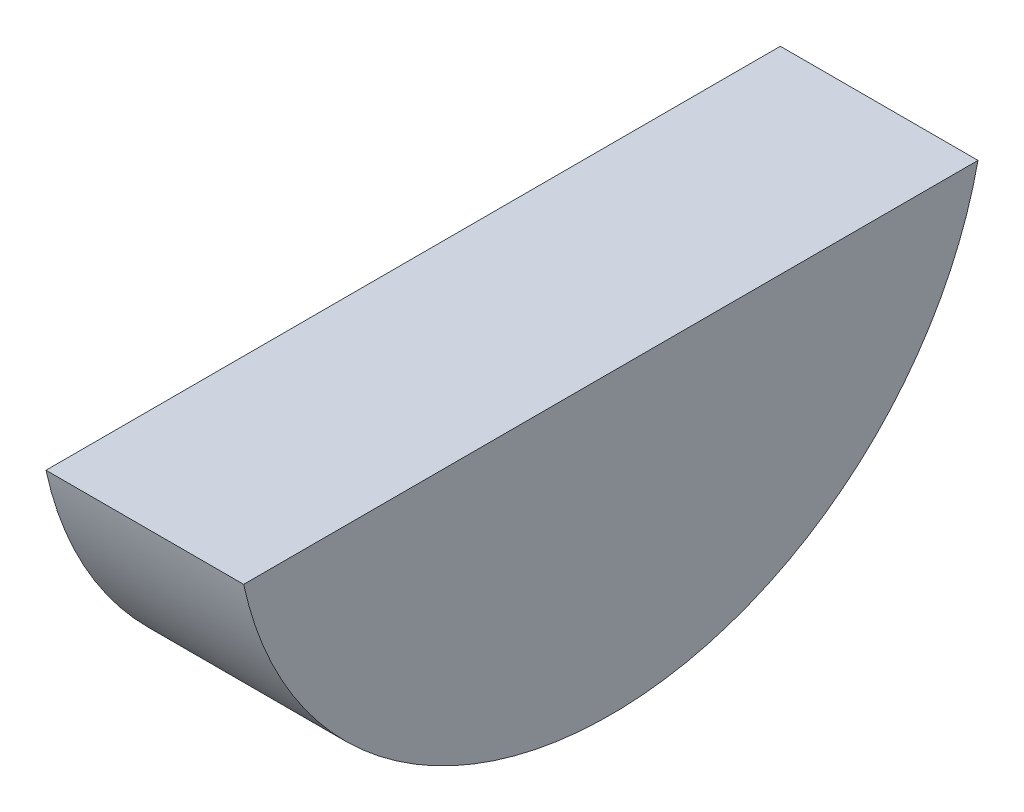
ISO-10303-21;
HEADER;
FILE_DESCRIPTION(('STEP AP214'),'2;1');
FILE_NAME('part.step','',(''),(''),'','','');
FILE_SCHEMA(('AUTOMOTIVE_DESIGN { 1 0 10303 214 1 1 1 1 }'));
ENDSEC;
DATA;
#1=APPLICATION_CONTEXT('core data for automotive mechanical design processes');
#2=APPLICATION_PROTOCOL_DEFINITION('international standard','automotive_design',2000,#1);
#3=PRODUCT_CONTEXT('',#1,'mechanical');
#4=PRODUCT('Part','Part','',(#3));
#5=PRODUCT_RELATED_PRODUCT_CATEGORY('part','',(#4));
#6=PRODUCT_DEFINITION_FORMATION('','',#4);
#7=PRODUCT_DEFINITION_CONTEXT('part definition',#1,'design');
#8=PRODUCT_DEFINITION('design','',#6,#7);
#9=PRODUCT_DEFINITION_SHAPE('','',#8);
#10=(LENGTH_UNIT() NAMED_UNIT(*) SI_UNIT(.MILLI.,.METRE.));
#11=(NAMED_UNIT(*) PLANE_ANGLE_UNIT() SI_UNIT($,.RADIAN.));
#12=(NAMED_UNIT(*) SI_UNIT($,.STERADIAN.) SOLID_ANGLE_UNIT());
#13=UNCERTAINTY_MEASURE_WITH_UNIT(LENGTH_MEASURE(1.E-05),#10,'distance_accuracy_value','');
#14=(GEOMETRIC_REPRESENTATION_CONTEXT(3) GLOBAL_UNCERTAINTY_ASSIGNED_CONTEXT((#13)) GLOBAL_UNIT_ASSIGNED_CONTEXT((#10,
#11,#12)) REPRESENTATION_CONTEXT('',''));
#15=CARTESIAN_POINT('',(0.,0.,0.));
#16=DIRECTION('',(0.,0.,1.));
#17=DIRECTION('',(1.,0.,0.));
#18=AXIS2_PLACEMENT_3D('',#15,#16,#17);
#19=CARTESIAN_POINT('',(5.,9.5,0.));
#20=DIRECTION('',(-1.,0.,0.));
#21=DIRECTION('',(0.,0.,1.));
#22=AXIS2_PLACEMENT_3D('',#19,#20,#21);
#23=CYLINDRICAL_SURFACE('',#22,9.5);
#24=CARTESIAN_POINT('',(0.,9.5,0.));
#25=DIRECTION('',(1.,0.,0.));
#26=DIRECTION('',(0.,0.,-1.));
#27=AXIS2_PLACEMENT_3D('',#24,#25,#26);
#28=CIRCLE('',#27,9.5);
#29=CARTESIAN_POINT('',(0.,7.5,9.28708781050335));
#30=VERTEX_POINT('',#29);
#31=CARTESIAN_POINT('',(0.,7.5,-9.28708781050335));
#32=VERTEX_POINT('',#31);
#33=EDGE_CURVE('E76',#30,#32,#28,.T.);
#34=ORIENTED_EDGE('',*,*,#33,.T.);
#35=DIRECTION('',(-1.,0.,0.));
#36=VECTOR('',#35,1.);
#37=CARTESIAN_POINT('',(5.,7.5,-9.28708781050335));
#38=LINE('',#37,#36);
#39=CARTESIAN_POINT('',(5.,7.5,-9.28708781050335));
#40=VERTEX_POINT('',#39);
#41=EDGE_CURVE('E11',#40,#32,#38,.T.);
#42=ORIENTED_EDGE('',*,*,#41,.F.);
#43=CARTESIAN_POINT('',(5.,9.5,0.));
#44=DIRECTION('',(1.,0.,0.));
#45=DIRECTION('',(0.,0.,-1.));
#46=AXIS2_PLACEMENT_3D('',#43,#44,#45);
#47=CIRCLE('',#46,9.5);
#48=CARTESIAN_POINT('',(5.,7.5,9.28708781050335));
#49=VERTEX_POINT('',#48);
#50=EDGE_CURVE('E75',#49,#40,#47,.T.);
#51=ORIENTED_EDGE('',*,*,#50,.F.);
#52=DIRECTION('',(-1.,0.,0.));
#53=VECTOR('',#52,1.);
#54=CARTESIAN_POINT('',(5.,7.5,9.28708781050335));
#55=LINE('',#54,#53);
#56=EDGE_CURVE('E52',#49,#30,#55,.T.);
#57=ORIENTED_EDGE('',*,*,#56,.T.);
#58=EDGE_LOOP('',(#34,#42,#51,#57));
#59=FACE_BOUND('',#58,.T.);
#60=ADVANCED_FACE('F43',(#59),#23,.T.);
#61=CARTESIAN_POINT('',(5.,7.5,9.28708781050335));
#62=DIRECTION('',(0.,-1.,0.));
#63=DIRECTION('',(0.,0.,-1.));
#64=AXIS2_PLACEMENT_3D('',#61,#62,#63);
#65=PLANE('',#64);
#66=DIRECTION('',(0.,0.,1.));
#67=VECTOR('',#66,1.);
#68=CARTESIAN_POINT('',(0.,7.5,9.28708781050335));
#69=LINE('',#68,#67);
#70=EDGE_CURVE('E67',#32,#30,#69,.T.);
#71=ORIENTED_EDGE('',*,*,#70,.T.);
#72=ORIENTED_EDGE('',*,*,#56,.F.);
#73=DIRECTION('',(0.,0.,1.));
#74=VECTOR('',#73,1.);
#75=CARTESIAN_POINT('',(5.,7.5,9.28708781050335));
#76=LINE('',#75,#74);
#77=EDGE_CURVE('E59',#40,#49,#76,.T.);
#78=ORIENTED_EDGE('',*,*,#77,.F.);
#79=ORIENTED_EDGE('',*,*,#41,.T.);
#80=EDGE_LOOP('',(#71,#72,#78,#79));
#81=FACE_BOUND('',#80,.T.);
#82=ADVANCED_FACE('F70',(#81),#65,.F.);
#83=CARTESIAN_POINT('',(5.,9.5,0.));
#84=DIRECTION('',(1.,0.,0.));
#85=DIRECTION('',(0.,0.,-1.));
#86=AXIS2_PLACEMENT_3D('',#83,#84,#85);
#87=PLANE('',#86);
#88=ORIENTED_EDGE('',*,*,#50,.T.);
#89=ORIENTED_EDGE('',*,*,#77,.T.);
#90=EDGE_LOOP('',(#88,#89));
#91=FACE_BOUND('',#90,.T.);
#92=ADVANCED_FACE('F87',(#91),#87,.T.);
#93=CARTESIAN_POINT('',(0.,9.5,0.));
#94=DIRECTION('',(1.,0.,0.));
#95=DIRECTION('',(0.,0.,-1.));
#96=AXIS2_PLACEMENT_3D('',#93,#94,#95);
#97=PLANE('',#96);
#98=ORIENTED_EDGE('',*,*,#33,.F.);
#99=ORIENTED_EDGE('',*,*,#70,.F.);
#100=EDGE_LOOP('',(#98,#99));
#101=FACE_BOUND('',#100,.T.);
#102=ADVANCED_FACE('F80',(#101),#97,.F.);
#103=CLOSED_SHELL('',(#60,#82,#92,#102));
#104=MANIFOLD_SOLID_BREP('B2',#103);
#105=ADVANCED_BREP_SHAPE_REPRESENTATION('',(#18,#104),#14);
#106=SHAPE_DEFINITION_REPRESENTATION(#9,#105);
ENDSEC;
END-ISO-10303-21;
